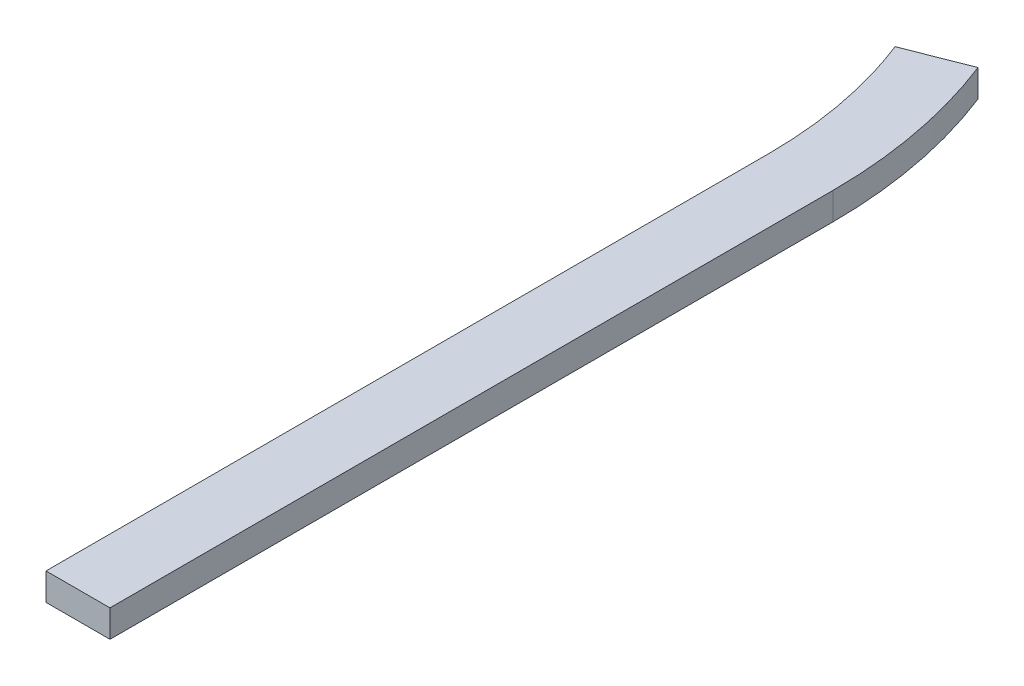
ISO-10303-21;
HEADER;
FILE_DESCRIPTION(('STEP AP214'),'2;1');
FILE_NAME('part.step','',(''),(''),'','','');
FILE_SCHEMA(('AUTOMOTIVE_DESIGN { 1 0 10303 214 1 1 1 1 }'));
ENDSEC;
DATA;
#1=APPLICATION_CONTEXT('core data for automotive mechanical design processes');
#2=APPLICATION_PROTOCOL_DEFINITION('international standard','automotive_design',2000,#1);
#3=PRODUCT_CONTEXT('',#1,'mechanical');
#4=PRODUCT('Part','Part','',(#3));
#5=PRODUCT_RELATED_PRODUCT_CATEGORY('part','',(#4));
#6=PRODUCT_DEFINITION_FORMATION('','',#4);
#7=PRODUCT_DEFINITION_CONTEXT('part definition',#1,'design');
#8=PRODUCT_DEFINITION('design','',#6,#7);
#9=PRODUCT_DEFINITION_SHAPE('','',#8);
#10=(LENGTH_UNIT() NAMED_UNIT(*) SI_UNIT(.MILLI.,.METRE.));
#11=(NAMED_UNIT(*) PLANE_ANGLE_UNIT() SI_UNIT($,.RADIAN.));
#12=(NAMED_UNIT(*) SI_UNIT($,.STERADIAN.) SOLID_ANGLE_UNIT());
#13=UNCERTAINTY_MEASURE_WITH_UNIT(LENGTH_MEASURE(1.E-05),#10,'distance_accuracy_value','');
#14=(GEOMETRIC_REPRESENTATION_CONTEXT(3) GLOBAL_UNCERTAINTY_ASSIGNED_CONTEXT((#13)) GLOBAL_UNIT_ASSIGNED_CONTEXT((#10,
#11,#12)) REPRESENTATION_CONTEXT('',''));
#15=CARTESIAN_POINT('',(0.,0.,0.));
#16=DIRECTION('',(0.,0.,1.));
#17=DIRECTION('',(1.,0.,0.));
#18=AXIS2_PLACEMENT_3D('',#15,#16,#17);
#19=CARTESIAN_POINT('',(207.328494434,5.057544144946,-74.04629190863));
#20=DIRECTION('',(-2.70770120341305E-05,-0.999999999633417,3.24071936401106E-08));
#21=DIRECTION('',(0.999999999633418,-2.70770120341305E-05,0.));
#22=AXIS2_PLACEMENT_3D('',#19,#20,#21);
#23=PLANE('',#22);
#24=DIRECTION('',(0.,3.24071936519905E-08,1.));
#25=VECTOR('',#24,1.);
#26=CARTESIAN_POINT('',(205.85,5.05758434817513,-68.8000019138906));
#27=LINE('',#26,#25);
#28=CARTESIAN_POINT('',(205.85,5.05758434826235,-68.7973105755422));
#29=VERTEX_POINT('',#28);
#30=CARTESIAN_POINT('',(205.85,5.05758579547706,-24.1401048920972));
#31=VERTEX_POINT('',#30);
#32=EDGE_CURVE('E71',#29,#31,#27,.T.);
#33=ORIENTED_EDGE('',*,*,#32,.F.);
#34=CARTESIAN_POINT('',(179.4760308089,5.05829847763227,-68.76372278604));
#35=DIRECTION('',(-2.70770120341305E-05,-0.999999999633417,3.24071936401106E-08));
#36=DIRECTION('',(0.999999283406053,-2.70770314274413E-05,-0.00119685179356063));
#37=AXIS2_PLACEMENT_3D('',#34,#35,#36);
#38=ELLIPSE('',#37,26.3739905881283,26.37399057846);
#39=CARTESIAN_POINT('',(204.030345615108,5.05763330818079,-78.3904046354799));
#40=VERTEX_POINT('',#39);
#41=EDGE_CURVE('E66',#29,#40,#38,.F.);
#42=ORIENTED_EDGE('',*,*,#41,.T.);
#43=DIRECTION('',(0.931004912756989,-2.52206600767147E-05,-0.36500664622205));
#44=VECTOR('',#43,1.);
#45=CARTESIAN_POINT('',(204.030345615962,5.05763330818077,-78.3904046356124));
#46=LINE('',#45,#44);
#47=CARTESIAN_POINT('',(207.707815021757,5.05753368657345,-79.8321808882869));
#48=VERTEX_POINT('',#47);
#49=EDGE_CURVE('E20',#40,#48,#46,.T.);
#50=ORIENTED_EDGE('',*,*,#49,.T.);
#51=CARTESIAN_POINT('',(179.4760308089,5.05829847763227,-68.76372278604));
#52=DIRECTION('',(-2.70770120341305E-05,-0.999999999633417,3.24071936401106E-08));
#53=DIRECTION('',(0.999999283406053,-2.70770314274413E-05,-0.00119685179356063));
#54=AXIS2_PLACEMENT_3D('',#51,#52,#53);
#55=ELLIPSE('',#54,30.3239905895763,30.32399057846);
#56=CARTESIAN_POINT('',(209.799999680402,5.05747739398607,-68.8000061525105));
#57=VERTEX_POINT('',#56);
#58=EDGE_CURVE('E102',#57,#48,#55,.F.);
#59=ORIENTED_EDGE('',*,*,#58,.F.);
#60=DIRECTION('',(8.77489972185671E-13,3.24071936282307E-08,1.));
#61=VECTOR('',#60,1.);
#62=CARTESIAN_POINT('',(209.799999680136,5.05747722396868,-74.04629190863));
#63=LINE('',#62,#61);
#64=CARTESIAN_POINT('',(209.799999945434,5.05759205689206,-24.1404988560864));
#65=VERTEX_POINT('',#64);
#66=EDGE_CURVE('E106',#57,#65,#63,.T.);
#67=ORIENTED_EDGE('',*,*,#66,.T.);
#68=DIRECTION('',(0.999999999633418,-2.70770120341305E-05,0.));
#69=VECTOR('',#68,1.);
#70=CARTESIAN_POINT('',(207.328494434044,5.05754576226547,-24.1401048920944));
#71=LINE('',#70,#69);
#72=EDGE_CURVE('E115',#65,#31,#71,.F.);
#73=ORIENTED_EDGE('',*,*,#72,.T.);
#74=EDGE_LOOP('',(#33,#42,#50,#59,#67,#73));
#75=FACE_BOUND('',#74,.T.);
#76=ADVANCED_FACE('F17',(#75),#23,.T.);
#77=CARTESIAN_POINT('',(205.8690803184,5.900276872448,-79.111292762));
#78=DIRECTION('',(0.365006646262099,0.,0.931004913082898));
#79=DIRECTION('',(0.931004913082898,0.,-0.365006646262099));
#80=AXIS2_PLACEMENT_3D('',#77,#78,#79);
#81=PLANE('',#80);
#82=DIRECTION('',(0.,-1.,0.));
#83=VECTOR('',#82,1.);
#84=CARTESIAN_POINT('',(204.030345615039,-54.,-78.3904046356553));
#85=LINE('',#84,#83);
#86=CARTESIAN_POINT('',(204.030345615046,6.7429326398098,-78.3904046356373));
#87=VERTEX_POINT('',#86);
#88=EDGE_CURVE('E75',#40,#87,#85,.F.);
#89=ORIENTED_EDGE('',*,*,#88,.T.);
#90=DIRECTION('',(-0.931004912421674,-3.76990417092251E-05,0.365006646001814));
#91=VECTOR('',#90,1.);
#92=CARTESIAN_POINT('',(207.707815021052,6.74308155102463,-79.8321808881158));
#93=LINE('',#92,#91);
#94=CARTESIAN_POINT('',(207.707815021724,6.74308155102466,-79.8321808883708));
#95=VERTEX_POINT('',#94);
#96=EDGE_CURVE('E100',#95,#87,#93,.T.);
#97=ORIENTED_EDGE('',*,*,#96,.F.);
#98=DIRECTION('',(0.,-1.,0.));
#99=VECTOR('',#98,1.);
#100=CARTESIAN_POINT('',(207.707815021778,-54.,-79.8321808882338));
#101=LINE('',#100,#99);
#102=EDGE_CURVE('E80',#48,#95,#101,.F.);
#103=ORIENTED_EDGE('',*,*,#102,.F.);
#104=ORIENTED_EDGE('',*,*,#49,.F.);
#105=EDGE_LOOP('',(#89,#97,#103,#104));
#106=FACE_BOUND('',#105,.T.);
#107=ADVANCED_FACE('F77',(#106),#81,.F.);
#108=CARTESIAN_POINT('',(179.4760308089,-54.,-68.76372278604));
#109=DIRECTION('',(0.,-1.,0.));
#110=DIRECTION('',(0.,0.,-1.));
#111=AXIS2_PLACEMENT_3D('',#108,#109,#110);
#112=CYLINDRICAL_SURFACE('',#111,26.37399057846);
#113=ORIENTED_EDGE('',*,*,#41,.F.);
#114=DIRECTION('',(0.,-0.999999114658701,0.00133066968600178));
#115=VECTOR('',#114,1.);
#116=CARTESIAN_POINT('',(205.85,6.742827441958,-68.79955265455));
#117=LINE('',#116,#115);
#118=CARTESIAN_POINT('',(205.85,6.74286302483761,-68.7995527018991));
#119=VERTEX_POINT('',#118);
#120=EDGE_CURVE('E86',#119,#29,#117,.T.);
#121=ORIENTED_EDGE('',*,*,#120,.F.);
#122=CARTESIAN_POINT('',(179.4760308089,6.74193836563824,-68.76372278604));
#123=DIRECTION('',(-3.50979930498897E-05,0.999999999289391,1.37604007816099E-05));
#124=DIRECTION('',(-0.931004912421339,-3.76990417093145E-05,0.365006646002669));
#125=AXIS2_PLACEMENT_3D('',#122,#123,#124);
#126=ELLIPSE('',#125,26.3739905972016,26.37399057846);
#127=EDGE_CURVE('E84',#87,#119,#126,.F.);
#128=ORIENTED_EDGE('',*,*,#127,.F.);
#129=ORIENTED_EDGE('',*,*,#88,.F.);
#130=EDGE_LOOP('',(#113,#121,#128,#129));
#131=FACE_BOUND('',#130,.T.);
#132=ADVANCED_FACE('F82',(#131),#112,.F.);
#133=CARTESIAN_POINT('',(205.85,-54.,-68.8));
#134=DIRECTION('',(-1.,0.,0.));
#135=DIRECTION('',(0.,0.,1.));
#136=AXIS2_PLACEMENT_3D('',#133,#134,#135);
#137=PLANE('',#136);
#138=DIRECTION('',(0.,1.,0.));
#139=VECTOR('',#138,1.);
#140=CARTESIAN_POINT('',(205.85,-54.,-24.1401048921));
#141=LINE('',#140,#139);
#142=CARTESIAN_POINT('',(205.85,6.74225000015931,-24.1401048943728));
#143=VERTEX_POINT('',#142);
#144=EDGE_CURVE('E111',#31,#143,#141,.T.);
#145=ORIENTED_EDGE('',*,*,#144,.T.);
#146=DIRECTION('',(0.,-1.37604007900854E-05,0.999999999905326));
#147=VECTOR('',#146,1.);
#148=CARTESIAN_POINT('',(205.85,6.7429367292946,-74.046291909344));
#149=LINE('',#148,#147);
#150=EDGE_CURVE('E96',#119,#143,#149,.T.);
#151=ORIENTED_EDGE('',*,*,#150,.F.);
#152=ORIENTED_EDGE('',*,*,#120,.T.);
#153=ORIENTED_EDGE('',*,*,#32,.T.);
#154=EDGE_LOOP('',(#145,#151,#152,#153));
#155=FACE_BOUND('',#154,.T.);
#156=ADVANCED_FACE('F121',(#155),#137,.T.);
#157=CARTESIAN_POINT('',(207.825,5.900192958571,-24.1401048921));
#158=DIRECTION('',(0.,0.,-1.));
#159=DIRECTION('',(-1.,0.,0.));
#160=AXIS2_PLACEMENT_3D('',#157,#158,#159);
#161=PLANE('',#160);
#162=ORIENTED_EDGE('',*,*,#144,.F.);
#163=ORIENTED_EDGE('',*,*,#72,.F.);
#164=DIRECTION('',(0.,1.,0.));
#165=VECTOR('',#164,1.);
#166=CARTESIAN_POINT('',(209.8000000012,5.900192958571,-24.1401048921));
#167=LINE('',#166,#165);
#168=CARTESIAN_POINT('',(209.800000004342,6.74238863723214,-24.1401048943728));
#169=VERTEX_POINT('',#168);
#170=EDGE_CURVE('E104',#65,#169,#167,.T.);
#171=ORIENTED_EDGE('',*,*,#170,.T.);
#172=DIRECTION('',(-0.999999999384066,-3.50979930532126E-05,0.));
#173=VECTOR('',#172,1.);
#174=CARTESIAN_POINT('',(207.328494458103,6.74230189234759,-24.1401048966457));
#175=LINE('',#174,#173);
#176=EDGE_CURVE('E93',#143,#169,#175,.F.);
#177=ORIENTED_EDGE('',*,*,#176,.F.);
#178=EDGE_LOOP('',(#162,#163,#171,#177));
#179=FACE_BOUND('',#178,.T.);
#180=ADVANCED_FACE('F126',(#179),#161,.F.);
#181=CARTESIAN_POINT('',(209.8,-54.,-68.8));
#182=DIRECTION('',(-1.,0.,0.));
#183=DIRECTION('',(0.,0.,1.));
#184=AXIS2_PLACEMENT_3D('',#181,#182,#183);
#185=PLANE('',#184);
#186=ORIENTED_EDGE('',*,*,#66,.F.);
#187=DIRECTION('',(0.,-1.,0.));
#188=VECTOR('',#187,1.);
#189=CARTESIAN_POINT('',(209.79999968104,-54.,-68.80000561987));
#190=LINE('',#189,#188);
#191=CARTESIAN_POINT('',(209.799999756735,6.74300317535936,-68.8000056202194));
#192=VERTEX_POINT('',#191);
#193=EDGE_CURVE('E35',#192,#57,#190,.T.);
#194=ORIENTED_EDGE('',*,*,#193,.F.);
#195=DIRECTION('',(4.82962451042364E-10,-1.37604007731344E-05,0.999999999905326));
#196=VECTOR('',#195,1.);
#197=CARTESIAN_POINT('',(209.799999981287,6.74307536636658,-74.04629190863));
#198=LINE('',#197,#196);
#199=EDGE_CURVE('E26',#169,#192,#198,.F.);
#200=ORIENTED_EDGE('',*,*,#199,.F.);
#201=ORIENTED_EDGE('',*,*,#170,.F.);
#202=EDGE_LOOP('',(#186,#194,#200,#201));
#203=FACE_BOUND('',#202,.T.);
#204=ADVANCED_FACE('F133',(#203),#185,.F.);
#205=CARTESIAN_POINT('',(179.4760308089,-54.,-68.76372278604));
#206=DIRECTION('',(0.,-1.,0.));
#207=DIRECTION('',(0.,0.,-1.));
#208=AXIS2_PLACEMENT_3D('',#205,#206,#207);
#209=CYLINDRICAL_SURFACE('',#208,30.32399057846);
#210=ORIENTED_EDGE('',*,*,#102,.T.);
#211=CARTESIAN_POINT('',(179.4760308089,6.74193836563824,-68.76372278604));
#212=DIRECTION('',(-3.50979930498897E-05,0.999999999289391,1.37604007816099E-05));
#213=DIRECTION('',(-0.931004912421339,-3.76990417093145E-05,0.365006646002669));
#214=AXIS2_PLACEMENT_3D('',#211,#212,#213);
#215=ELLIPSE('',#214,30.3239906000085,30.32399057846);
#216=EDGE_CURVE('E11',#192,#95,#215,.T.);
#217=ORIENTED_EDGE('',*,*,#216,.F.);
#218=ORIENTED_EDGE('',*,*,#193,.T.);
#219=ORIENTED_EDGE('',*,*,#58,.T.);
#220=EDGE_LOOP('',(#210,#217,#218,#219));
#221=FACE_BOUND('',#220,.T.);
#222=ADVANCED_FACE('F131',(#221),#209,.T.);
#223=CARTESIAN_POINT('',(207.328494434,6.742988621482,-74.04629190863));
#224=DIRECTION('',(-3.50979930498897E-05,0.999999999289391,1.37604007816099E-05));
#225=DIRECTION('',(-0.999999999384066,-3.50979930532126E-05,0.));
#226=AXIS2_PLACEMENT_3D('',#223,#224,#225);
#227=PLANE('',#226);
#228=ORIENTED_EDGE('',*,*,#199,.T.);
#229=ORIENTED_EDGE('',*,*,#216,.T.);
#230=ORIENTED_EDGE('',*,*,#96,.T.);
#231=ORIENTED_EDGE('',*,*,#127,.T.);
#232=ORIENTED_EDGE('',*,*,#150,.T.);
#233=ORIENTED_EDGE('',*,*,#176,.T.);
#234=EDGE_LOOP('',(#228,#229,#230,#231,#232,#233));
#235=FACE_BOUND('',#234,.T.);
#236=ADVANCED_FACE('F129',(#235),#227,.T.);
#237=CLOSED_SHELL('',(#76,#107,#132,#156,#180,#204,#222,#236));
#238=MANIFOLD_SOLID_BREP('B1',#237);
#239=ADVANCED_BREP_SHAPE_REPRESENTATION('',(#18,#238),#14);
#240=SHAPE_DEFINITION_REPRESENTATION(#9,#239);
ENDSEC;
END-ISO-10303-21;
